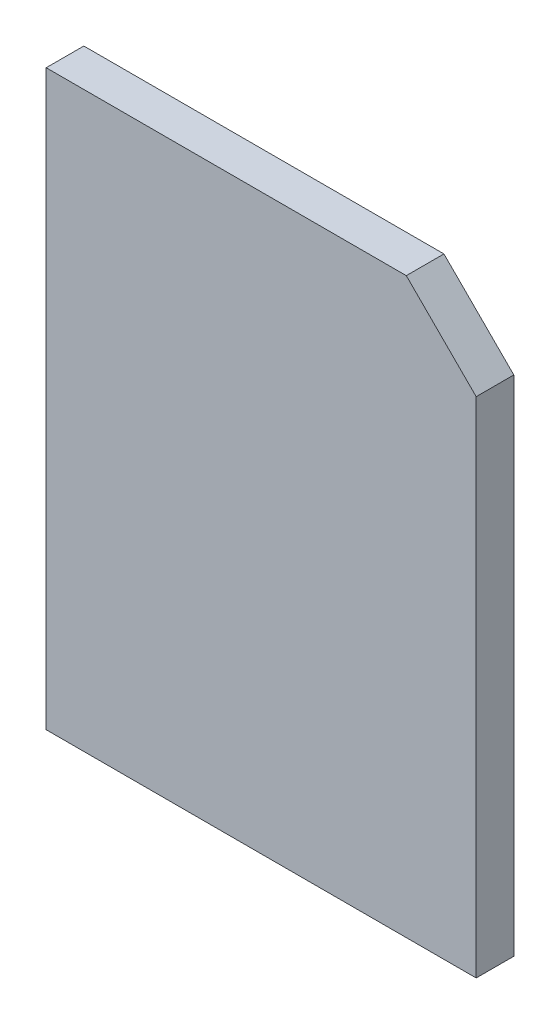
ISO-10303-21;
HEADER;
FILE_DESCRIPTION(('STEP AP214'),'2;1');
FILE_NAME('part.step','',(''),(''),'','','');
FILE_SCHEMA(('AUTOMOTIVE_DESIGN { 1 0 10303 214 1 1 1 1 }'));
ENDSEC;
DATA;
#1=APPLICATION_CONTEXT('core data for automotive mechanical design processes');
#2=APPLICATION_PROTOCOL_DEFINITION('international standard','automotive_design',2000,#1);
#3=PRODUCT_CONTEXT('',#1,'mechanical');
#4=PRODUCT('Part','Part','',(#3));
#5=PRODUCT_RELATED_PRODUCT_CATEGORY('part','',(#4));
#6=PRODUCT_DEFINITION_FORMATION('','',#4);
#7=PRODUCT_DEFINITION_CONTEXT('part definition',#1,'design');
#8=PRODUCT_DEFINITION('design','',#6,#7);
#9=PRODUCT_DEFINITION_SHAPE('','',#8);
#10=(LENGTH_UNIT() NAMED_UNIT(*) SI_UNIT(.MILLI.,.METRE.));
#11=(NAMED_UNIT(*) PLANE_ANGLE_UNIT() SI_UNIT($,.RADIAN.));
#12=(NAMED_UNIT(*) SI_UNIT($,.STERADIAN.) SOLID_ANGLE_UNIT());
#13=UNCERTAINTY_MEASURE_WITH_UNIT(LENGTH_MEASURE(1.E-05),#10,'distance_accuracy_value','');
#14=(GEOMETRIC_REPRESENTATION_CONTEXT(3) GLOBAL_UNCERTAINTY_ASSIGNED_CONTEXT((#13)) GLOBAL_UNIT_ASSIGNED_CONTEXT((#10,
#11,#12)) REPRESENTATION_CONTEXT('',''));
#15=CARTESIAN_POINT('',(0.,0.,0.));
#16=DIRECTION('',(0.,0.,1.));
#17=DIRECTION('',(1.,0.,0.));
#18=AXIS2_PLACEMENT_3D('',#15,#16,#17);
#19=CARTESIAN_POINT('',(12.,-16.,1.05));
#20=DIRECTION('',(-1.,0.,0.));
#21=DIRECTION('',(0.,0.,1.));
#22=AXIS2_PLACEMENT_3D('',#19,#20,#21);
#23=PLANE('',#22);
#24=DIRECTION('',(0.,1.,0.));
#25=VECTOR('',#24,1.);
#26=CARTESIAN_POINT('',(12.,-16.,-1.05));
#27=LINE('',#26,#25);
#28=CARTESIAN_POINT('',(12.,-16.,-1.05));
#29=VERTEX_POINT('',#28);
#30=CARTESIAN_POINT('',(12.,12.1,-1.05));
#31=VERTEX_POINT('',#30);
#32=EDGE_CURVE('E103',#29,#31,#27,.T.);
#33=ORIENTED_EDGE('',*,*,#32,.T.);
#34=DIRECTION('',(0.,0.,1.));
#35=VECTOR('',#34,1.);
#36=CARTESIAN_POINT('',(12.,12.1,-1.05));
#37=LINE('',#36,#35);
#38=CARTESIAN_POINT('',(12.,12.1,1.05));
#39=VERTEX_POINT('',#38);
#40=EDGE_CURVE('E47',#31,#39,#37,.T.);
#41=ORIENTED_EDGE('',*,*,#40,.T.);
#42=DIRECTION('',(0.,1.,0.));
#43=VECTOR('',#42,1.);
#44=CARTESIAN_POINT('',(12.,-16.,1.05));
#45=LINE('',#44,#43);
#46=CARTESIAN_POINT('',(12.,-16.,1.05));
#47=VERTEX_POINT('',#46);
#48=EDGE_CURVE('E110',#47,#39,#45,.T.);
#49=ORIENTED_EDGE('',*,*,#48,.F.);
#50=DIRECTION('',(0.,0.,-1.));
#51=VECTOR('',#50,1.);
#52=CARTESIAN_POINT('',(12.,-16.,1.05));
#53=LINE('',#52,#51);
#54=EDGE_CURVE('E111',#47,#29,#53,.T.);
#55=ORIENTED_EDGE('',*,*,#54,.T.);
#56=EDGE_LOOP('',(#33,#41,#49,#55));
#57=FACE_BOUND('',#56,.T.);
#58=ADVANCED_FACE('F33',(#57),#23,.F.);
#59=CARTESIAN_POINT('',(-12.,16.,1.05));
#60=DIRECTION('',(0.,-1.,0.));
#61=DIRECTION('',(0.,0.,-1.));
#62=AXIS2_PLACEMENT_3D('',#59,#60,#61);
#63=PLANE('',#62);
#64=DIRECTION('',(-1.,0.,0.));
#65=VECTOR('',#64,1.);
#66=CARTESIAN_POINT('',(-12.,16.,1.05));
#67=LINE('',#66,#65);
#68=CARTESIAN_POINT('',(8.09999999999999,16.,1.05));
#69=VERTEX_POINT('',#68);
#70=CARTESIAN_POINT('',(-12.,16.,1.05));
#71=VERTEX_POINT('',#70);
#72=EDGE_CURVE('E78',#69,#71,#67,.T.);
#73=ORIENTED_EDGE('',*,*,#72,.F.);
#74=DIRECTION('',(0.,0.,1.));
#75=VECTOR('',#74,1.);
#76=CARTESIAN_POINT('',(8.09999999999999,16.,-1.05));
#77=LINE('',#76,#75);
#78=CARTESIAN_POINT('',(8.09999999999999,16.,-1.05));
#79=VERTEX_POINT('',#78);
#80=EDGE_CURVE('E89',#79,#69,#77,.T.);
#81=ORIENTED_EDGE('',*,*,#80,.F.);
#82=DIRECTION('',(-1.,0.,0.));
#83=VECTOR('',#82,1.);
#84=CARTESIAN_POINT('',(-12.,16.,-1.05));
#85=LINE('',#84,#83);
#86=CARTESIAN_POINT('',(-12.,16.,-1.05));
#87=VERTEX_POINT('',#86);
#88=EDGE_CURVE('E98',#79,#87,#85,.T.);
#89=ORIENTED_EDGE('',*,*,#88,.T.);
#90=DIRECTION('',(0.,0.,-1.));
#91=VECTOR('',#90,1.);
#92=CARTESIAN_POINT('',(-12.,16.,1.05));
#93=LINE('',#92,#91);
#94=EDGE_CURVE('E11',#71,#87,#93,.T.);
#95=ORIENTED_EDGE('',*,*,#94,.F.);
#96=EDGE_LOOP('',(#73,#81,#89,#95));
#97=FACE_BOUND('',#96,.T.);
#98=ADVANCED_FACE('F97',(#97),#63,.F.);
#99=CARTESIAN_POINT('',(-12.,-16.,1.05));
#100=DIRECTION('',(1.,0.,0.));
#101=DIRECTION('',(0.,0.,-1.));
#102=AXIS2_PLACEMENT_3D('',#99,#100,#101);
#103=PLANE('',#102);
#104=DIRECTION('',(0.,-1.,0.));
#105=VECTOR('',#104,1.);
#106=CARTESIAN_POINT('',(-12.,-16.,-1.05));
#107=LINE('',#106,#105);
#108=CARTESIAN_POINT('',(-12.,-16.,-1.05));
#109=VERTEX_POINT('',#108);
#110=EDGE_CURVE('E102',#87,#109,#107,.T.);
#111=ORIENTED_EDGE('',*,*,#110,.T.);
#112=DIRECTION('',(0.,0.,-1.));
#113=VECTOR('',#112,1.);
#114=CARTESIAN_POINT('',(-12.,-16.,1.05));
#115=LINE('',#114,#113);
#116=CARTESIAN_POINT('',(-12.,-16.,1.05));
#117=VERTEX_POINT('',#116);
#118=EDGE_CURVE('E40',#117,#109,#115,.T.);
#119=ORIENTED_EDGE('',*,*,#118,.F.);
#120=DIRECTION('',(0.,-1.,0.));
#121=VECTOR('',#120,1.);
#122=CARTESIAN_POINT('',(-12.,-16.,1.05));
#123=LINE('',#122,#121);
#124=EDGE_CURVE('E119',#71,#117,#123,.T.);
#125=ORIENTED_EDGE('',*,*,#124,.F.);
#126=ORIENTED_EDGE('',*,*,#94,.T.);
#127=EDGE_LOOP('',(#111,#119,#125,#126));
#128=FACE_BOUND('',#127,.T.);
#129=ADVANCED_FACE('F124',(#128),#103,.F.);
#130=CARTESIAN_POINT('',(-12.,-16.,1.05));
#131=DIRECTION('',(0.,1.,0.));
#132=DIRECTION('',(0.,0.,1.));
#133=AXIS2_PLACEMENT_3D('',#130,#131,#132);
#134=PLANE('',#133);
#135=DIRECTION('',(1.,0.,0.));
#136=VECTOR('',#135,1.);
#137=CARTESIAN_POINT('',(-12.,-16.,-1.05));
#138=LINE('',#137,#136);
#139=EDGE_CURVE('E73',#109,#29,#138,.T.);
#140=ORIENTED_EDGE('',*,*,#139,.T.);
#141=ORIENTED_EDGE('',*,*,#54,.F.);
#142=DIRECTION('',(1.,0.,0.));
#143=VECTOR('',#142,1.);
#144=CARTESIAN_POINT('',(-12.,-16.,1.05));
#145=LINE('',#144,#143);
#146=EDGE_CURVE('E56',#117,#47,#145,.T.);
#147=ORIENTED_EDGE('',*,*,#146,.F.);
#148=ORIENTED_EDGE('',*,*,#118,.T.);
#149=EDGE_LOOP('',(#140,#141,#147,#148));
#150=FACE_BOUND('',#149,.T.);
#151=ADVANCED_FACE('F113',(#150),#134,.F.);
#152=CARTESIAN_POINT('',(0.,0.,1.05));
#153=DIRECTION('',(0.,0.,-1.));
#154=DIRECTION('',(-1.,0.,0.));
#155=AXIS2_PLACEMENT_3D('',#152,#153,#154);
#156=PLANE('',#155);
#157=ORIENTED_EDGE('',*,*,#48,.T.);
#158=DIRECTION('',(0.707106781186548,-0.707106781186548,0.));
#159=VECTOR('',#158,1.);
#160=CARTESIAN_POINT('',(8.09999999999999,16.,1.05));
#161=LINE('',#160,#159);
#162=EDGE_CURVE('E94',#69,#39,#161,.T.);
#163=ORIENTED_EDGE('',*,*,#162,.F.);
#164=ORIENTED_EDGE('',*,*,#72,.T.);
#165=ORIENTED_EDGE('',*,*,#124,.T.);
#166=ORIENTED_EDGE('',*,*,#146,.T.);
#167=EDGE_LOOP('',(#157,#163,#164,#165,#166));
#168=FACE_BOUND('',#167,.T.);
#169=ADVANCED_FACE('F123',(#168),#156,.F.);
#170=CARTESIAN_POINT('',(0.,0.,-1.05));
#171=DIRECTION('',(0.,0.,-1.));
#172=DIRECTION('',(-1.,0.,0.));
#173=AXIS2_PLACEMENT_3D('',#170,#171,#172);
#174=PLANE('',#173);
#175=DIRECTION('',(0.707106781186548,-0.707106781186548,0.));
#176=VECTOR('',#175,1.);
#177=CARTESIAN_POINT('',(8.09999999999999,16.,-1.05));
#178=LINE('',#177,#176);
#179=EDGE_CURVE('E86',#79,#31,#178,.T.);
#180=ORIENTED_EDGE('',*,*,#179,.T.);
#181=ORIENTED_EDGE('',*,*,#32,.F.);
#182=ORIENTED_EDGE('',*,*,#139,.F.);
#183=ORIENTED_EDGE('',*,*,#110,.F.);
#184=ORIENTED_EDGE('',*,*,#88,.F.);
#185=EDGE_LOOP('',(#180,#181,#182,#183,#184));
#186=FACE_BOUND('',#185,.T.);
#187=ADVANCED_FACE('F101',(#186),#174,.T.);
#188=CARTESIAN_POINT('',(8.09999999999999,16.,-1.05));
#189=DIRECTION('',(-0.707106781186548,-0.707106781186548,0.));
#190=DIRECTION('',(0.707106781186548,-0.707106781186548,0.));
#191=AXIS2_PLACEMENT_3D('',#188,#189,#190);
#192=PLANE('',#191);
#193=ORIENTED_EDGE('',*,*,#162,.T.);
#194=ORIENTED_EDGE('',*,*,#40,.F.);
#195=ORIENTED_EDGE('',*,*,#179,.F.);
#196=ORIENTED_EDGE('',*,*,#80,.T.);
#197=EDGE_LOOP('',(#193,#194,#195,#196));
#198=FACE_BOUND('',#197,.T.);
#199=ADVANCED_FACE('F88',(#198),#192,.F.);
#200=CLOSED_SHELL('',(#58,#98,#129,#151,#169,#187,#199));
#201=MANIFOLD_SOLID_BREP('B2',#200);
#202=ADVANCED_BREP_SHAPE_REPRESENTATION('',(#18,#201),#14);
#203=SHAPE_DEFINITION_REPRESENTATION(#9,#202);
ENDSEC;
END-ISO-10303-21;
